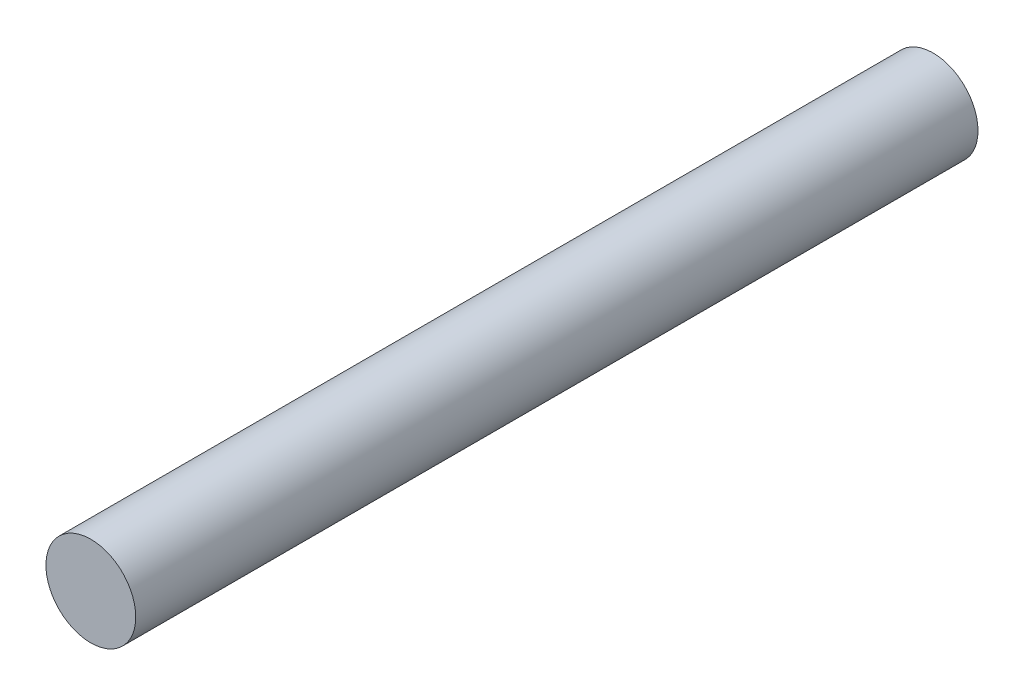
ISO-10303-21;
HEADER;
FILE_DESCRIPTION(('STEP AP214'),'2;1');
FILE_NAME('part.step','',(''),(''),'','','');
FILE_SCHEMA(('AUTOMOTIVE_DESIGN { 1 0 10303 214 1 1 1 1 }'));
ENDSEC;
DATA;
#1=APPLICATION_CONTEXT('core data for automotive mechanical design processes');
#2=APPLICATION_PROTOCOL_DEFINITION('international standard','automotive_design',2000,#1);
#3=PRODUCT_CONTEXT('',#1,'mechanical');
#4=PRODUCT('Part','Part','',(#3));
#5=PRODUCT_RELATED_PRODUCT_CATEGORY('part','',(#4));
#6=PRODUCT_DEFINITION_FORMATION('','',#4);
#7=PRODUCT_DEFINITION_CONTEXT('part definition',#1,'design');
#8=PRODUCT_DEFINITION('design','',#6,#7);
#9=PRODUCT_DEFINITION_SHAPE('','',#8);
#10=(LENGTH_UNIT() NAMED_UNIT(*) SI_UNIT(.MILLI.,.METRE.));
#11=(NAMED_UNIT(*) PLANE_ANGLE_UNIT() SI_UNIT($,.RADIAN.));
#12=(NAMED_UNIT(*) SI_UNIT($,.STERADIAN.) SOLID_ANGLE_UNIT());
#13=UNCERTAINTY_MEASURE_WITH_UNIT(LENGTH_MEASURE(1.E-05),#10,'distance_accuracy_value','');
#14=(GEOMETRIC_REPRESENTATION_CONTEXT(3) GLOBAL_UNCERTAINTY_ASSIGNED_CONTEXT((#13)) GLOBAL_UNIT_ASSIGNED_CONTEXT((#10,
#11,#12)) REPRESENTATION_CONTEXT('',''));
#15=CARTESIAN_POINT('',(0.,0.,0.));
#16=DIRECTION('',(0.,0.,1.));
#17=DIRECTION('',(1.,0.,0.));
#18=AXIS2_PLACEMENT_3D('',#15,#16,#17);
#19=CARTESIAN_POINT('',(0.,0.,300.));
#20=DIRECTION('',(0.,0.,-1.));
#21=DIRECTION('',(-1.,0.,0.));
#22=AXIS2_PLACEMENT_3D('',#19,#20,#21);
#23=CYLINDRICAL_SURFACE('',#22,16.);
#24=CARTESIAN_POINT('',(0.,0.,300.));
#25=DIRECTION('',(0.,0.,1.));
#26=DIRECTION('',(1.,0.,0.));
#27=AXIS2_PLACEMENT_3D('',#24,#25,#26);
#28=CIRCLE('',#27,16.);
#29=CARTESIAN_POINT('',(16.,0.,300.));
#30=VERTEX_POINT('',#29);
#31=EDGE_CURVE('E10',#30,#30,#28,.T.);
#32=ORIENTED_EDGE('',*,*,#31,.F.);
#33=EDGE_LOOP('',(#32));
#34=FACE_BOUND('',#33,.T.);
#35=CARTESIAN_POINT('',(0.,0.,0.));
#36=DIRECTION('',(0.,0.,1.));
#37=DIRECTION('',(1.,0.,0.));
#38=AXIS2_PLACEMENT_3D('',#35,#36,#37);
#39=CIRCLE('',#38,16.);
#40=CARTESIAN_POINT('',(16.,0.,0.));
#41=VERTEX_POINT('',#40);
#42=EDGE_CURVE('E38',#41,#41,#39,.T.);
#43=ORIENTED_EDGE('',*,*,#42,.T.);
#44=EDGE_LOOP('',(#43));
#45=FACE_BOUND('',#44,.T.);
#46=ADVANCED_FACE('F35',(#34,#45),#23,.T.);
#47=CARTESIAN_POINT('',(0.,0.,300.));
#48=DIRECTION('',(0.,0.,1.));
#49=DIRECTION('',(1.,0.,0.));
#50=AXIS2_PLACEMENT_3D('',#47,#48,#49);
#51=PLANE('',#50);
#52=ORIENTED_EDGE('',*,*,#31,.T.);
#53=EDGE_LOOP('',(#52));
#54=FACE_BOUND('',#53,.T.);
#55=ADVANCED_FACE('F50',(#54),#51,.T.);
#56=CARTESIAN_POINT('',(0.,0.,0.));
#57=DIRECTION('',(0.,0.,1.));
#58=DIRECTION('',(1.,0.,0.));
#59=AXIS2_PLACEMENT_3D('',#56,#57,#58);
#60=PLANE('',#59);
#61=ORIENTED_EDGE('',*,*,#42,.F.);
#62=EDGE_LOOP('',(#61));
#63=FACE_BOUND('',#62,.T.);
#64=ADVANCED_FACE('F48',(#63),#60,.F.);
#65=CLOSED_SHELL('',(#46,#55,#64));
#66=MANIFOLD_SOLID_BREP('B2',#65);
#67=ADVANCED_BREP_SHAPE_REPRESENTATION('',(#18,#66),#14);
#68=SHAPE_DEFINITION_REPRESENTATION(#9,#67);
ENDSEC;
END-ISO-10303-21;
